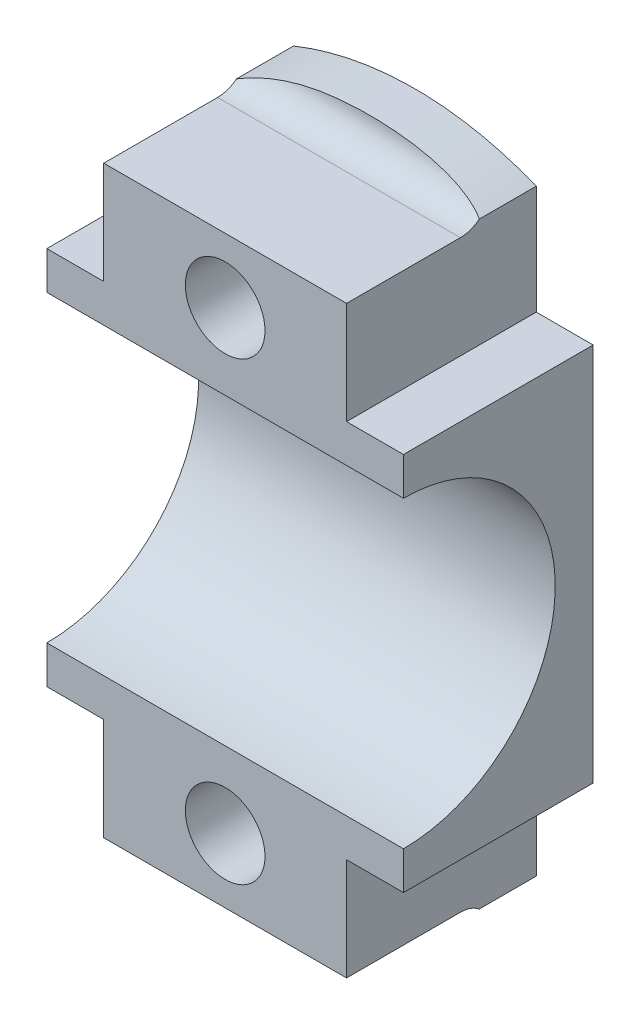
ISO-10303-21;
HEADER;
FILE_DESCRIPTION(('STEP AP214'),'2;1');
FILE_NAME('part.step','',(''),(''),'','','');
FILE_SCHEMA(('AUTOMOTIVE_DESIGN { 1 0 10303 214 1 1 1 1 }'));
ENDSEC;
DATA;
#1=APPLICATION_CONTEXT('core data for automotive mechanical design processes');
#2=APPLICATION_PROTOCOL_DEFINITION('international standard','automotive_design',2000,#1);
#3=PRODUCT_CONTEXT('',#1,'mechanical');
#4=PRODUCT('Part','Part','',(#3));
#5=PRODUCT_RELATED_PRODUCT_CATEGORY('part','',(#4));
#6=PRODUCT_DEFINITION_FORMATION('','',#4);
#7=PRODUCT_DEFINITION_CONTEXT('part definition',#1,'design');
#8=PRODUCT_DEFINITION('design','',#6,#7);
#9=PRODUCT_DEFINITION_SHAPE('','',#8);
#10=(LENGTH_UNIT() NAMED_UNIT(*) SI_UNIT(.MILLI.,.METRE.));
#11=(NAMED_UNIT(*) PLANE_ANGLE_UNIT() SI_UNIT($,.RADIAN.));
#12=(NAMED_UNIT(*) SI_UNIT($,.STERADIAN.) SOLID_ANGLE_UNIT());
#13=UNCERTAINTY_MEASURE_WITH_UNIT(LENGTH_MEASURE(1.E-05),#10,'distance_accuracy_value','');
#14=(GEOMETRIC_REPRESENTATION_CONTEXT(3) GLOBAL_UNCERTAINTY_ASSIGNED_CONTEXT((#13)) GLOBAL_UNIT_ASSIGNED_CONTEXT((#10,
#11,#12)) REPRESENTATION_CONTEXT('',''));
#15=CARTESIAN_POINT('',(0.,0.,0.));
#16=DIRECTION('',(0.,0.,1.));
#17=DIRECTION('',(1.,0.,0.));
#18=AXIS2_PLACEMENT_3D('',#15,#16,#17);
#19=CARTESIAN_POINT('',(-32.,0.,50.));
#20=DIRECTION('',(-1.,0.,0.));
#21=DIRECTION('',(0.,-1.,0.));
#22=AXIS2_PLACEMENT_3D('',#19,#20,#21);
#23=PLANE('',#22);
#24=DIRECTION('',(0.,0.,-1.));
#25=VECTOR('',#24,1.);
#26=CARTESIAN_POINT('',(-32.,-78.7464284904401,50.));
#27=LINE('',#26,#25);
#28=CARTESIAN_POINT('',(-32.,-78.7464284904402,15.010727169735));
#29=VERTEX_POINT('',#28);
#30=CARTESIAN_POINT('',(-32.,-78.7464284904401,0.));
#31=VERTEX_POINT('',#30);
#32=EDGE_CURVE('E306',#29,#31,#27,.T.);
#33=ORIENTED_EDGE('',*,*,#32,.F.);
#34=CARTESIAN_POINT('',(-32.,-85.0000000000001,20.));
#35=DIRECTION('',(-1.,0.,0.));
#36=DIRECTION('',(0.,-1.,0.));
#37=AXIS2_PLACEMENT_3D('',#34,#35,#36);
#38=CIRCLE('',#37,8.);
#39=CARTESIAN_POINT('',(-32.,-77.0000000000001,20.));
#40=VERTEX_POINT('',#39);
#41=EDGE_CURVE('E377',#29,#40,#38,.F.);
#42=ORIENTED_EDGE('',*,*,#41,.T.);
#43=DIRECTION('',(0.,0.,1.));
#44=VECTOR('',#43,1.);
#45=CARTESIAN_POINT('',(-32.,-77.,50.));
#46=LINE('',#45,#44);
#47=CARTESIAN_POINT('',(-32.,-77.,50.));
#48=VERTEX_POINT('',#47);
#49=EDGE_CURVE('E359',#40,#48,#46,.T.);
#50=ORIENTED_EDGE('',*,*,#49,.T.);
#51=DIRECTION('',(0.,1.,0.));
#52=VECTOR('',#51,1.);
#53=CARTESIAN_POINT('',(-32.,0.,50.));
#54=LINE('',#53,#52);
#55=CARTESIAN_POINT('',(-32.,-50.,50.));
#56=VERTEX_POINT('',#55);
#57=EDGE_CURVE('E204',#48,#56,#54,.T.);
#58=ORIENTED_EDGE('',*,*,#57,.T.);
#59=DIRECTION('',(0.,0.,-1.));
#60=VECTOR('',#59,1.);
#61=CARTESIAN_POINT('',(-32.,-50.,50.));
#62=LINE('',#61,#60);
#63=CARTESIAN_POINT('',(-32.,-50.,0.));
#64=VERTEX_POINT('',#63);
#65=EDGE_CURVE('E309',#56,#64,#62,.T.);
#66=ORIENTED_EDGE('',*,*,#65,.T.);
#67=DIRECTION('',(0.,1.,0.));
#68=VECTOR('',#67,1.);
#69=CARTESIAN_POINT('',(-32.,0.,0.));
#70=LINE('',#69,#68);
#71=EDGE_CURVE('E259',#31,#64,#70,.T.);
#72=ORIENTED_EDGE('',*,*,#71,.F.);
#73=EDGE_LOOP('',(#33,#42,#50,#58,#66,#72));
#74=FACE_BOUND('',#73,.T.);
#75=ADVANCED_FACE('F45',(#74),#23,.T.);
#76=CARTESIAN_POINT('',(0.,0.,50.));
#77=DIRECTION('',(0.,0.,-1.));
#78=DIRECTION('',(-1.,0.,0.));
#79=AXIS2_PLACEMENT_3D('',#76,#77,#78);
#80=CYLINDRICAL_SURFACE('',#79,85.);
#81=CARTESIAN_POINT('',(-32.,-78.7464284904402,15.010727169735));
#82=CARTESIAN_POINT('',(-31.8757358525958,-78.7969259631387,14.9474403065465));
#83=CARTESIAN_POINT('',(-31.7505314078796,-78.8474616876477,14.8860619473166));
#84=CARTESIAN_POINT('',(-31.4984410883804,-78.9485061891417,14.7668805031187));
#85=CARTESIAN_POINT('',(-31.3715554202109,-78.9990149686588,14.7090769836805));
#86=CARTESIAN_POINT('',(-30.9888000532411,-79.1502968126886,14.5407188232782));
#87=CARTESIAN_POINT('',(-30.7306654661683,-79.2508931137261,14.4351326895298));
#88=CARTESIAN_POINT('',(-30.2102660206429,-79.4507227251986,14.2358551926228));
#89=CARTESIAN_POINT('',(-29.9480140682081,-79.5499589633642,14.1421327450534));
#90=CARTESIAN_POINT('',(-29.4194905065431,-79.7469317802375,13.9648671175983));
#91=CARTESIAN_POINT('',(-29.1532181665553,-79.8446680796405,13.8813258139215));
#92=CARTESIAN_POINT('',(-28.6197469155445,-80.0374275781302,13.723997382611));
#93=CARTESIAN_POINT('',(-28.352577549491,-80.1324672174964,13.6501297586469));
#94=CARTESIAN_POINT('',(-27.8154537364429,-80.3204924356775,13.5103211598452));
#95=CARTESIAN_POINT('',(-27.5454991838961,-80.4134779362227,13.4443804866278));
#96=CARTESIAN_POINT('',(-27.0029889840283,-80.5972746197671,13.3195539953761));
#97=CARTESIAN_POINT('',(-26.7304314656932,-80.688084043413,13.2606737412709));
#98=CARTESIAN_POINT('',(-26.1832255651242,-80.8673086230854,13.1493076059319));
#99=CARTESIAN_POINT('',(-25.9085770949637,-80.955723677706,13.0968219951948));
#100=CARTESIAN_POINT('',(-25.207435447781,-81.1774869333944,12.9706036992787));
#101=CARTESIAN_POINT('',(-24.7796708726665,-81.3090948211613,12.9008580995404));
#102=CARTESIAN_POINT('',(-23.9204883515242,-81.5659937944659,12.7730943728766));
#103=CARTESIAN_POINT('',(-23.4890700485291,-81.6912842542813,12.7150774059312));
#104=CARTESIAN_POINT('',(-22.6230162932327,-81.9353501706612,12.6090849264248));
#105=CARTESIAN_POINT('',(-22.1883797936106,-82.05412339005,12.561112846259));
#106=CARTESIAN_POINT('',(-21.3164485800991,-82.284946548221,12.4737987532041));
#107=CARTESIAN_POINT('',(-20.879153731436,-82.3969961429432,12.4344571816804));
#108=CARTESIAN_POINT('',(-20.0017605279184,-82.614369676465,12.3631242924503));
#109=CARTESIAN_POINT('',(-19.5616595046269,-82.7196856439983,12.3311415739297));
#110=CARTESIAN_POINT('',(-18.6794328936537,-82.9233608511334,12.2735034072661));
#111=CARTESIAN_POINT('',(-18.2373072393048,-83.0217198598761,12.2478481690233));
#112=CARTESIAN_POINT('',(-16.9084381845925,-83.3062137560634,12.1789186903612));
#113=CARTESIAN_POINT('',(-16.0189990570267,-83.481815977195,12.1436650785596));
#114=CARTESIAN_POINT('',(-14.2255337906455,-83.806164225363,12.0878552906622));
#115=CARTESIAN_POINT('',(-13.321451129509,-83.9546204224826,12.0674514940243));
#116=CARTESIAN_POINT('',(-11.5087684315474,-84.2222513421853,12.0367565018833));
#117=CARTESIAN_POINT('',(-10.6001682423792,-84.3414250703581,12.0264656497724));
#118=CARTESIAN_POINT('',(-8.78023041593695,-84.5502566320817,12.0119670534763));
#119=CARTESIAN_POINT('',(-7.86889532826723,-84.6399364311942,12.0077547743253));
#120=CARTESIAN_POINT('',(-6.04380561869229,-84.7898034386422,12.0024108492913));
#121=CARTESIAN_POINT('',(-5.13005101490067,-84.8499908671469,12.0012791804101));
#122=CARTESIAN_POINT('',(-3.24435022335478,-84.9436268770276,12.0000515815455));
#123=CARTESIAN_POINT('',(-2.27230964744263,-84.9751856582418,12.0000242392115));
#124=CARTESIAN_POINT('',(-0.327708373695421,-85.0049305503612,11.999988115955));
#125=CARTESIAN_POINT('',(0.644852330537703,-85.0031162408427,11.9999793352663));
#126=CARTESIAN_POINT('',(2.58978071352564,-84.9661078829973,12.0000502626269));
#127=CARTESIAN_POINT('',(3.56214810457567,-84.9308986927157,12.00013001082));
#128=CARTESIAN_POINT('',(5.50508842483872,-84.8271209167262,12.0016999222396));
#129=CARTESIAN_POINT('',(6.47566137515311,-84.7585527258337,12.0031900687738));
#130=CARTESIAN_POINT('',(8.4136471374115,-84.5881581724898,12.0101525774523));
#131=CARTESIAN_POINT('',(9.38106063530471,-84.486339591549,12.0156240082336));
#132=CARTESIAN_POINT('',(11.3117985020905,-84.2495652441591,12.0343896777821));
#133=CARTESIAN_POINT('',(12.2751226684498,-84.114607855475,12.0476842995604));
#134=CARTESIAN_POINT('',(14.1956822381422,-83.8118536933647,12.0872459498619));
#135=CARTESIAN_POINT('',(15.1529215087344,-83.6440805130592,12.1135036790261));
#136=CARTESIAN_POINT('',(16.5834155377374,-83.3680167669548,12.1676732931317));
#137=CARTESIAN_POINT('',(17.0593352122547,-83.271932198385,12.1881926344927));
#138=CARTESIAN_POINT('',(18.0091718797905,-83.0716874879059,12.2351940301253));
#139=CARTESIAN_POINT('',(18.483088936429,-82.9675276046017,12.2616758935039));
#140=CARTESIAN_POINT('',(19.4232606959077,-82.7524430928749,12.3214064221138));
#141=CARTESIAN_POINT('',(19.8895411888483,-82.6416090331872,12.3545745735627));
#142=CARTESIAN_POINT('',(20.8195411583314,-82.4122325290468,12.4291342650418));
#143=CARTESIAN_POINT('',(21.2832606817342,-82.2936902261491,12.4705256540884));
#144=CARTESIAN_POINT('',(22.2080280814761,-82.0489634028035,12.5630308119746));
#145=CARTESIAN_POINT('',(22.6690741041527,-81.9227741459549,12.6141506492892));
#146=CARTESIAN_POINT('',(23.5876741580192,-81.6630236489972,12.727813668086));
#147=CARTESIAN_POINT('',(24.0452282592067,-81.5294625571049,12.7903566199556));
#148=CARTESIAN_POINT('',(24.9525846657081,-81.2563302592026,12.9283543613565));
#149=CARTESIAN_POINT('',(25.4024196458548,-81.1168147398521,13.0037034645616));
#150=CARTESIAN_POINT('',(26.2971701170268,-80.8311782033854,13.1700467776598));
#151=CARTESIAN_POINT('',(26.7420850028781,-80.685056384695,13.2610428898553));
#152=CARTESIAN_POINT('',(27.6251334792002,-80.3869944338232,13.4614677603964));
#153=CARTESIAN_POINT('',(28.0632751218969,-80.2350620996677,13.5708724408555));
#154=CARTESIAN_POINT('',(28.9315312469562,-79.9260818996247,13.8118016706136));
#155=CARTESIAN_POINT('',(29.3616487299869,-79.7690360088358,13.9433177592723));
#156=CARTESIAN_POINT('',(29.9757413916559,-79.5392724546682,14.152813745155));
#157=CARTESIAN_POINT('',(30.1639763758568,-79.4680730787051,14.2200510646715));
#158=CARTESIAN_POINT('',(30.5380157567482,-79.3250884590081,14.3603704978529));
#159=CARTESIAN_POINT('',(30.7238204004463,-79.253303276036,14.4334520120874));
#160=CARTESIAN_POINT('',(31.0933213077323,-79.1090691213609,14.5863100990613));
#161=CARTESIAN_POINT('',(31.2770071641088,-79.0366186740239,14.6661105533953));
#162=CARTESIAN_POINT('',(31.6411035851384,-78.8915654471925,14.8328770502627));
#163=CARTESIAN_POINT('',(31.8215131683405,-78.8189626290894,14.9198451981322));
#164=CARTESIAN_POINT('',(32.,-78.7464284904401,15.0107271697349));
#165=B_SPLINE_CURVE_WITH_KNOTS('',3,(#81,#82,#83,#84,#85,#86,#87,#88,#89,#90,#91,#92,#93,#94,
#95,#96,#97,#98,#99,#100,#101,#102,#103,#104,#105,#106,#107,#108,#109,#110,#111,#112,#113,#114,
#115,#116,#117,#118,#119,#120,#121,#122,#123,#124,#125,#126,#127,#128,#129,#130,#131,#132,#133,
#134,#135,#136,#137,#138,#139,#140,#141,#142,#143,#144,#145,#146,#147,#148,#149,#150,#151,#152,
#153,#154,#155,#156,#157,#158,#159,#160,#161,#162,#163,#164),.UNSPECIFIED.,.F.,.F.,(4,2,2,2,2,2,
2,2,2,2,2,2,2,2,2,2,2,2,2,2,2,2,2,2,2,2,2,2,2,2,2,2,2,2,2,2,2,2,2,2,2,4),(0.,0.444902145031601,
0.889750111944361,1.7788515985983,2.6655730567173,3.55245767598101,4.43141666898508,
5.31040909575958,6.19008971835571,7.06980753899216,8.42841337606781,9.78715351571338,
11.1463571896645,12.5056303572905,13.8664839264444,15.2273826328715,17.9485493919856,
20.6972598202735,23.4460635797826,26.1928155111862,28.9395469369654,31.8566263976373,
34.7737426067818,37.6921821315679,40.6105871164566,43.5283096027539,46.4461749480121,
49.3619501358289,50.8197297807598,52.2774627608147,53.7185912995455,55.1596933807258,
56.6016973661144,58.0436723693869,59.4742786459207,60.9050589731255,62.3339822240157,
63.7623599553684,64.3988397885675,65.0352544224937,65.6740352057967,66.3130042887355),.UNSPECIFIED.);
#166=CARTESIAN_POINT('',(32.,-78.7464284904401,15.0107271697349));
#167=VERTEX_POINT('',#166);
#168=EDGE_CURVE('E363',#29,#167,#165,.T.);
#169=ORIENTED_EDGE('',*,*,#168,.F.);
#170=ORIENTED_EDGE('',*,*,#32,.T.);
#171=CARTESIAN_POINT('',(0.,0.,0.));
#172=DIRECTION('',(0.,0.,1.));
#173=DIRECTION('',(1.,0.,0.));
#174=AXIS2_PLACEMENT_3D('',#171,#172,#173);
#175=CIRCLE('',#174,85.);
#176=CARTESIAN_POINT('',(32.,-78.7464284904401,0.));
#177=VERTEX_POINT('',#176);
#178=EDGE_CURVE('E263',#31,#177,#175,.T.);
#179=ORIENTED_EDGE('',*,*,#178,.T.);
#180=DIRECTION('',(0.,0.,-1.));
#181=VECTOR('',#180,1.);
#182=CARTESIAN_POINT('',(32.,-78.7464284904401,50.));
#183=LINE('',#182,#181);
#184=EDGE_CURVE('E303',#167,#177,#183,.T.);
#185=ORIENTED_EDGE('',*,*,#184,.F.);
#186=EDGE_LOOP('',(#169,#170,#179,#185));
#187=FACE_BOUND('',#186,.T.);
#188=ADVANCED_FACE('F379',(#187),#80,.T.);
#189=CARTESIAN_POINT('',(32.,0.,50.));
#190=DIRECTION('',(-1.,0.,0.));
#191=DIRECTION('',(0.,-1.,0.));
#192=AXIS2_PLACEMENT_3D('',#189,#190,#191);
#193=PLANE('',#192);
#194=CARTESIAN_POINT('',(32.,-85.,20.));
#195=DIRECTION('',(-1.,0.,0.));
#196=DIRECTION('',(0.,-1.,0.));
#197=AXIS2_PLACEMENT_3D('',#194,#195,#196);
#198=CIRCLE('',#197,8.);
#199=CARTESIAN_POINT('',(32.,-77.,20.));
#200=VERTEX_POINT('',#199);
#201=EDGE_CURVE('E333',#167,#200,#198,.F.);
#202=ORIENTED_EDGE('',*,*,#201,.F.);
#203=ORIENTED_EDGE('',*,*,#184,.T.);
#204=DIRECTION('',(0.,1.,0.));
#205=VECTOR('',#204,1.);
#206=CARTESIAN_POINT('',(32.,0.,0.));
#207=LINE('',#206,#205);
#208=CARTESIAN_POINT('',(32.,-50.,0.));
#209=VERTEX_POINT('',#208);
#210=EDGE_CURVE('E267',#177,#209,#207,.T.);
#211=ORIENTED_EDGE('',*,*,#210,.T.);
#212=DIRECTION('',(0.,0.,-1.));
#213=VECTOR('',#212,1.);
#214=CARTESIAN_POINT('',(32.,-50.,50.));
#215=LINE('',#214,#213);
#216=CARTESIAN_POINT('',(32.,-50.,50.));
#217=VERTEX_POINT('',#216);
#218=EDGE_CURVE('E299',#217,#209,#215,.T.);
#219=ORIENTED_EDGE('',*,*,#218,.F.);
#220=DIRECTION('',(0.,1.,0.));
#221=VECTOR('',#220,1.);
#222=CARTESIAN_POINT('',(32.,0.,50.));
#223=LINE('',#222,#221);
#224=CARTESIAN_POINT('',(32.,-77.,50.));
#225=VERTEX_POINT('',#224);
#226=EDGE_CURVE('E211',#225,#217,#223,.T.);
#227=ORIENTED_EDGE('',*,*,#226,.F.);
#228=DIRECTION('',(0.,0.,1.));
#229=VECTOR('',#228,1.);
#230=CARTESIAN_POINT('',(32.,-77.,50.));
#231=LINE('',#230,#229);
#232=EDGE_CURVE('E69',#200,#225,#231,.T.);
#233=ORIENTED_EDGE('',*,*,#232,.F.);
#234=EDGE_LOOP('',(#202,#203,#211,#219,#227,#233));
#235=FACE_BOUND('',#234,.T.);
#236=ADVANCED_FACE('F395',(#235),#193,.F.);
#237=CARTESIAN_POINT('',(0.,0.,50.));
#238=DIRECTION('',(0.,0.,1.));
#239=DIRECTION('',(1.,0.,0.));
#240=AXIS2_PLACEMENT_3D('',#237,#238,#239);
#241=PLANE('',#240);
#242=DIRECTION('',(1.,0.,0.));
#243=VECTOR('',#242,1.);
#244=CARTESIAN_POINT('',(-47.0000000000001,-40.0000000000001,50.));
#245=LINE('',#244,#243);
#246=CARTESIAN_POINT('',(-47.0000000000001,-40.0000000000001,50.));
#247=VERTEX_POINT('',#246);
#248=CARTESIAN_POINT('',(47.0000000000001,-39.9999999999999,50.));
#249=VERTEX_POINT('',#248);
#250=EDGE_CURVE('E179',#247,#249,#245,.T.);
#251=ORIENTED_EDGE('',*,*,#250,.F.);
#252=DIRECTION('',(0.,-1.,0.));
#253=VECTOR('',#252,1.);
#254=CARTESIAN_POINT('',(-47.,0.,50.));
#255=LINE('',#254,#253);
#256=CARTESIAN_POINT('',(-47.,-50.,50.));
#257=VERTEX_POINT('',#256);
#258=EDGE_CURVE('E188',#247,#257,#255,.T.);
#259=ORIENTED_EDGE('',*,*,#258,.T.);
#260=DIRECTION('',(-1.,0.,0.));
#261=VECTOR('',#260,1.);
#262=CARTESIAN_POINT('',(0.,-50.,50.));
#263=LINE('',#262,#261);
#264=EDGE_CURVE('E199',#56,#257,#263,.T.);
#265=ORIENTED_EDGE('',*,*,#264,.F.);
#266=ORIENTED_EDGE('',*,*,#57,.F.);
#267=DIRECTION('',(1.,0.,0.));
#268=VECTOR('',#267,1.);
#269=CARTESIAN_POINT('',(1.06858966120171E-13,-77.,50.));
#270=LINE('',#269,#268);
#271=EDGE_CURVE('E327',#48,#225,#270,.T.);
#272=ORIENTED_EDGE('',*,*,#271,.T.);
#273=ORIENTED_EDGE('',*,*,#226,.T.);
#274=DIRECTION('',(1.,0.,0.));
#275=VECTOR('',#274,1.);
#276=CARTESIAN_POINT('',(0.,-50.,50.));
#277=LINE('',#276,#275);
#278=CARTESIAN_POINT('',(47.,-50.,50.));
#279=VERTEX_POINT('',#278);
#280=EDGE_CURVE('E214',#217,#279,#277,.T.);
#281=ORIENTED_EDGE('',*,*,#280,.T.);
#282=DIRECTION('',(0.,-1.,0.));
#283=VECTOR('',#282,1.);
#284=CARTESIAN_POINT('',(47.0000000000001,0.,50.));
#285=LINE('',#284,#283);
#286=EDGE_CURVE('E218',#249,#279,#285,.T.);
#287=ORIENTED_EDGE('',*,*,#286,.F.);
#288=EDGE_LOOP('',(#251,#259,#265,#266,#272,#273,#281,#287));
#289=FACE_BOUND('',#288,.T.);
#290=CARTESIAN_POINT('',(0.,-60.,50.));
#291=DIRECTION('',(0.,0.,1.));
#292=DIRECTION('',(1.,0.,0.));
#293=AXIS2_PLACEMENT_3D('',#290,#291,#292);
#294=CIRCLE('',#293,10.5);
#295=CARTESIAN_POINT('',(10.5,-60.,50.));
#296=VERTEX_POINT('',#295);
#297=EDGE_CURVE('E230',#296,#296,#294,.T.);
#298=ORIENTED_EDGE('',*,*,#297,.F.);
#299=EDGE_LOOP('',(#298));
#300=FACE_BOUND('',#299,.T.);
#301=ADVANCED_FACE('F392',(#289,#300),#241,.T.);
#302=DIRECTION('',(1.,0.,0.));
#303=VECTOR('',#302,1.);
#304=CARTESIAN_POINT('',(-1.06858966120171E-13,77.,50.));
#305=LINE('',#304,#303);
#306=CARTESIAN_POINT('',(-32.,77.,50.));
#307=VERTEX_POINT('',#306);
#308=CARTESIAN_POINT('',(32.,77.0000000000001,50.));
#309=VERTEX_POINT('',#308);
#310=EDGE_CURVE('E330',#307,#309,#305,.T.);
#311=ORIENTED_EDGE('',*,*,#310,.F.);
#312=DIRECTION('',(0.,1.,0.));
#313=VECTOR('',#312,1.);
#314=CARTESIAN_POINT('',(-32.,0.,50.));
#315=LINE('',#314,#313);
#316=CARTESIAN_POINT('',(-32.,50.,50.));
#317=VERTEX_POINT('',#316);
#318=EDGE_CURVE('E357',#317,#307,#315,.T.);
#319=ORIENTED_EDGE('',*,*,#318,.F.);
#320=DIRECTION('',(-1.,0.,0.));
#321=VECTOR('',#320,1.);
#322=CARTESIAN_POINT('',(0.,50.,50.));
#323=LINE('',#322,#321);
#324=CARTESIAN_POINT('',(-47.,50.,50.));
#325=VERTEX_POINT('',#324);
#326=EDGE_CURVE('E196',#317,#325,#323,.T.);
#327=ORIENTED_EDGE('',*,*,#326,.T.);
#328=CARTESIAN_POINT('',(-47.0000000000002,39.9999999999999,50.));
#329=VERTEX_POINT('',#328);
#330=EDGE_CURVE('E186',#325,#329,#255,.T.);
#331=ORIENTED_EDGE('',*,*,#330,.T.);
#332=DIRECTION('',(1.,0.,0.));
#333=VECTOR('',#332,1.);
#334=CARTESIAN_POINT('',(-47.0000000000002,39.9999999999999,50.));
#335=LINE('',#334,#333);
#336=CARTESIAN_POINT('',(47.,40.,50.));
#337=VERTEX_POINT('',#336);
#338=EDGE_CURVE('E169',#329,#337,#335,.T.);
#339=ORIENTED_EDGE('',*,*,#338,.T.);
#340=CARTESIAN_POINT('',(47.,50.,50.));
#341=VERTEX_POINT('',#340);
#342=EDGE_CURVE('E219',#341,#337,#285,.T.);
#343=ORIENTED_EDGE('',*,*,#342,.F.);
#344=DIRECTION('',(1.,0.,0.));
#345=VECTOR('',#344,1.);
#346=CARTESIAN_POINT('',(0.,50.,50.));
#347=LINE('',#346,#345);
#348=CARTESIAN_POINT('',(32.,50.,50.));
#349=VERTEX_POINT('',#348);
#350=EDGE_CURVE('E222',#349,#341,#347,.T.);
#351=ORIENTED_EDGE('',*,*,#350,.F.);
#352=DIRECTION('',(0.,1.,0.));
#353=VECTOR('',#352,1.);
#354=CARTESIAN_POINT('',(32.,0.,50.));
#355=LINE('',#354,#353);
#356=EDGE_CURVE('E290',#349,#309,#355,.T.);
#357=ORIENTED_EDGE('',*,*,#356,.T.);
#358=EDGE_LOOP('',(#311,#319,#327,#331,#339,#343,#351,#357));
#359=FACE_BOUND('',#358,.T.);
#360=CARTESIAN_POINT('',(0.,60.,50.));
#361=DIRECTION('',(0.,0.,1.));
#362=DIRECTION('',(1.,0.,0.));
#363=AXIS2_PLACEMENT_3D('',#360,#361,#362);
#364=CIRCLE('',#363,10.5);
#365=CARTESIAN_POINT('',(10.5,60.,50.));
#366=VERTEX_POINT('',#365);
#367=EDGE_CURVE('E226',#366,#366,#364,.F.);
#368=ORIENTED_EDGE('',*,*,#367,.T.);
#369=EDGE_LOOP('',(#368));
#370=FACE_BOUND('',#369,.T.);
#371=ADVANCED_FACE('F192',(#359,#370),#241,.T.);
#372=CARTESIAN_POINT('',(32.,0.,50.));
#373=DIRECTION('',(-1.,0.,0.));
#374=DIRECTION('',(0.,0.,1.));
#375=AXIS2_PLACEMENT_3D('',#372,#373,#374);
#376=PLANE('',#375);
#377=CARTESIAN_POINT('',(32.,85.0000000000001,20.));
#378=DIRECTION('',(-1.,0.,0.));
#379=DIRECTION('',(0.,0.,1.));
#380=AXIS2_PLACEMENT_3D('',#377,#378,#379);
#381=CIRCLE('',#380,8.);
#382=CARTESIAN_POINT('',(32.,78.7464284904401,15.010727169735));
#383=VERTEX_POINT('',#382);
#384=CARTESIAN_POINT('',(32.,77.0000000000001,20.));
#385=VERTEX_POINT('',#384);
#386=EDGE_CURVE('E240',#383,#385,#381,.T.);
#387=ORIENTED_EDGE('',*,*,#386,.T.);
#388=DIRECTION('',(0.,0.,1.));
#389=VECTOR('',#388,1.);
#390=CARTESIAN_POINT('',(32.,77.0000000000001,50.));
#391=LINE('',#390,#389);
#392=EDGE_CURVE('E352',#385,#309,#391,.T.);
#393=ORIENTED_EDGE('',*,*,#392,.T.);
#394=ORIENTED_EDGE('',*,*,#356,.F.);
#395=DIRECTION('',(0.,0.,-1.));
#396=VECTOR('',#395,1.);
#397=CARTESIAN_POINT('',(32.,50.,50.));
#398=LINE('',#397,#396);
#399=CARTESIAN_POINT('',(32.,50.,0.));
#400=VERTEX_POINT('',#399);
#401=EDGE_CURVE('E234',#349,#400,#398,.T.);
#402=ORIENTED_EDGE('',*,*,#401,.T.);
#403=DIRECTION('',(0.,1.,0.));
#404=VECTOR('',#403,1.);
#405=CARTESIAN_POINT('',(32.,0.,0.));
#406=LINE('',#405,#404);
#407=CARTESIAN_POINT('',(32.,78.7464284904401,0.));
#408=VERTEX_POINT('',#407);
#409=EDGE_CURVE('E235',#400,#408,#406,.T.);
#410=ORIENTED_EDGE('',*,*,#409,.T.);
#411=DIRECTION('',(0.,0.,-1.));
#412=VECTOR('',#411,1.);
#413=CARTESIAN_POINT('',(32.,78.7464284904401,50.));
#414=LINE('',#413,#412);
#415=EDGE_CURVE('E324',#383,#408,#414,.T.);
#416=ORIENTED_EDGE('',*,*,#415,.F.);
#417=EDGE_LOOP('',(#387,#393,#394,#402,#410,#416));
#418=FACE_BOUND('',#417,.T.);
#419=ADVANCED_FACE('F47',(#418),#376,.F.);
#420=CARTESIAN_POINT('',(0.,0.,50.));
#421=DIRECTION('',(0.,0.,-1.));
#422=DIRECTION('',(-1.,0.,0.));
#423=AXIS2_PLACEMENT_3D('',#420,#421,#422);
#424=CYLINDRICAL_SURFACE('',#423,85.);
#425=DIRECTION('',(0.,0.,-1.));
#426=VECTOR('',#425,1.);
#427=CARTESIAN_POINT('',(-32.,78.7464284904401,50.));
#428=LINE('',#427,#426);
#429=CARTESIAN_POINT('',(-32.,78.7464284904401,15.0107271697349));
#430=VERTEX_POINT('',#429);
#431=CARTESIAN_POINT('',(-32.,78.7464284904401,0.));
#432=VERTEX_POINT('',#431);
#433=EDGE_CURVE('E321',#430,#432,#428,.T.);
#434=ORIENTED_EDGE('',*,*,#433,.F.);
#435=CARTESIAN_POINT('',(-32.,78.7464284904401,15.0107271697349));
#436=CARTESIAN_POINT('',(-31.8757358525959,78.7969259631387,14.9474403065464));
#437=CARTESIAN_POINT('',(-31.7505314078797,78.8474616876477,14.8860619473165));
#438=CARTESIAN_POINT('',(-31.4984410883804,78.9485061891417,14.7668805031186));
#439=CARTESIAN_POINT('',(-31.3715554202109,78.9990149686588,14.7090769836804));
#440=CARTESIAN_POINT('',(-30.9888000532411,79.1502968126886,14.5407188232781));
#441=CARTESIAN_POINT('',(-30.7306654661683,79.2508931137261,14.4351326895297));
#442=CARTESIAN_POINT('',(-30.2102660206429,79.4507227251986,14.2358551926227));
#443=CARTESIAN_POINT('',(-29.9480140682081,79.5499589633642,14.1421327450534));
#444=CARTESIAN_POINT('',(-29.419490506543,79.7469317802375,13.9648671175982));
#445=CARTESIAN_POINT('',(-29.1532181665553,79.8446680796405,13.8813258139214));
#446=CARTESIAN_POINT('',(-28.6197469155444,80.0374275781303,13.723997382611));
#447=CARTESIAN_POINT('',(-28.352577549491,80.1324672174964,13.6501297586468));
#448=CARTESIAN_POINT('',(-27.8154537364429,80.3204924356775,13.5103211598451));
#449=CARTESIAN_POINT('',(-27.5454991838961,80.4134779362228,13.4443804866277));
#450=CARTESIAN_POINT('',(-27.0029889840283,80.5972746197671,13.319553995376));
#451=CARTESIAN_POINT('',(-26.7304314656932,80.688084043413,13.2606737412709));
#452=CARTESIAN_POINT('',(-26.1832255651241,80.8673086230855,13.1493076059319));
#453=CARTESIAN_POINT('',(-25.9085770949636,80.955723677706,13.0968219951947));
#454=CARTESIAN_POINT('',(-25.2074354477809,81.1774869333945,12.9706036992787));
#455=CARTESIAN_POINT('',(-24.7796708726664,81.3090948211614,12.9008580995403));
#456=CARTESIAN_POINT('',(-23.9204883515241,81.565993794466,12.7730943728765));
#457=CARTESIAN_POINT('',(-23.4890700485289,81.6912842542813,12.7150774059312));
#458=CARTESIAN_POINT('',(-22.6230162932325,81.9353501706612,12.6090849264248));
#459=CARTESIAN_POINT('',(-22.1883797936104,82.0541233900501,12.561112846259));
#460=CARTESIAN_POINT('',(-21.3164485800989,82.284946548221,12.473798753204));
#461=CARTESIAN_POINT('',(-20.8791537314358,82.3969961429432,12.4344571816804));
#462=CARTESIAN_POINT('',(-20.0017605279182,82.6143696764651,12.3631242924503));
#463=CARTESIAN_POINT('',(-19.5616595046266,82.7196856439984,12.3311415739297));
#464=CARTESIAN_POINT('',(-18.6794328936534,82.9233608511334,12.2735034072661));
#465=CARTESIAN_POINT('',(-18.2373072393045,83.0217198598761,12.2478481690233));
#466=CARTESIAN_POINT('',(-16.9084381845922,83.3062137560634,12.1789186903612));
#467=CARTESIAN_POINT('',(-16.0189990570264,83.4818159771951,12.1436650785595));
#468=CARTESIAN_POINT('',(-14.2255337906451,83.806164225363,12.0878552906622));
#469=CARTESIAN_POINT('',(-13.3214511295086,83.9546204224826,12.0674514940243));
#470=CARTESIAN_POINT('',(-11.5087684315469,84.2222513421853,12.0367565018833));
#471=CARTESIAN_POINT('',(-10.6001682423787,84.3414250703581,12.0264656497724));
#472=CARTESIAN_POINT('',(-8.78023041593644,84.5502566320817,12.0119670534763));
#473=CARTESIAN_POINT('',(-7.8688953282667,84.6399364311943,12.0077547743253));
#474=CARTESIAN_POINT('',(-6.04380561869172,84.7898034386422,12.0024108492913));
#475=CARTESIAN_POINT('',(-5.13005101490007,84.8499908671469,12.0012791804101));
#476=CARTESIAN_POINT('',(-3.24435022335414,84.9436268770276,12.0000515815455));
#477=CARTESIAN_POINT('',(-2.27230964744197,84.9751856582418,12.0000242392115));
#478=CARTESIAN_POINT('',(-0.327708373694724,85.0049305503612,11.999988115955));
#479=CARTESIAN_POINT('',(0.64485233053842,85.0031162408427,11.9999793352663));
#480=CARTESIAN_POINT('',(2.5897807135264,84.9661078829973,12.0000502626269));
#481=CARTESIAN_POINT('',(3.56214810457644,84.9308986927156,12.00013001082));
#482=CARTESIAN_POINT('',(5.50508842483954,84.8271209167262,12.0016999222396));
#483=CARTESIAN_POINT('',(6.47566137515394,84.7585527258336,12.0031900687738));
#484=CARTESIAN_POINT('',(8.41364713741237,84.5881581724897,12.0101525774523));
#485=CARTESIAN_POINT('',(9.3810606353056,84.4863395915489,12.0156240082336));
#486=CARTESIAN_POINT('',(11.3117985020914,84.249565244159,12.0343896777821));
#487=CARTESIAN_POINT('',(12.2751226684508,84.1146078554748,12.0476842995604));
#488=CARTESIAN_POINT('',(14.1956822381432,83.8118536933646,12.087245949862));
#489=CARTESIAN_POINT('',(15.1529215087354,83.644080513059,12.1135036790261));
#490=CARTESIAN_POINT('',(16.5834155377384,83.3680167669546,12.1676732931317));
#491=CARTESIAN_POINT('',(17.0593352122558,83.2719321983848,12.1881926344927));
#492=CARTESIAN_POINT('',(18.0091718797916,83.0716874879057,12.2351940301253));
#493=CARTESIAN_POINT('',(18.48308893643,82.9675276046015,12.261675893504));
#494=CARTESIAN_POINT('',(19.4232606959088,82.7524430928747,12.3214064221139));
#495=CARTESIAN_POINT('',(19.8895411888492,82.6416090331869,12.3545745735628));
#496=CARTESIAN_POINT('',(20.8195411583322,82.4122325290465,12.4291342650419));
#497=CARTESIAN_POINT('',(21.2832606817351,82.2936902261488,12.4705256540885));
#498=CARTESIAN_POINT('',(22.2080280814768,82.0489634028032,12.5630308119747));
#499=CARTESIAN_POINT('',(22.6690741041535,81.9227741459546,12.6141506492893));
#500=CARTESIAN_POINT('',(23.5876741580199,81.6630236489971,12.7278136680861));
#501=CARTESIAN_POINT('',(24.0452282592073,81.5294625571048,12.7903566199557));
#502=CARTESIAN_POINT('',(24.9525846657086,81.2563302592025,12.9283543613566));
#503=CARTESIAN_POINT('',(25.4024196458553,81.1168147398519,13.0037034645618));
#504=CARTESIAN_POINT('',(26.2971701170273,80.8311782033853,13.17004677766));
#505=CARTESIAN_POINT('',(26.7420850028785,80.6850563846949,13.2610428898555));
#506=CARTESIAN_POINT('',(27.6251334792005,80.3869944338231,13.4614677603965));
#507=CARTESIAN_POINT('',(28.0632751218971,80.2350620996676,13.5708724408556));
#508=CARTESIAN_POINT('',(28.9315312469564,79.9260818996246,13.8118016706137));
#509=CARTESIAN_POINT('',(29.361648729987,79.7690360088357,13.9433177592724));
#510=CARTESIAN_POINT('',(29.975741391656,79.5392724546681,14.1528137451551));
#511=CARTESIAN_POINT('',(30.1639763758569,79.468073078705,14.2200510646716));
#512=CARTESIAN_POINT('',(30.5380157567483,79.325088459008,14.3603704978531));
#513=CARTESIAN_POINT('',(30.7238204004464,79.2533032760359,14.4334520120876));
#514=CARTESIAN_POINT('',(31.0933213077324,79.1090691213609,14.5863100990615));
#515=CARTESIAN_POINT('',(31.2770071641088,79.0366186740239,14.6661105533954));
#516=CARTESIAN_POINT('',(31.6411035851384,78.8915654471926,14.8328770502628));
#517=CARTESIAN_POINT('',(31.8215131683406,78.8189626290894,14.9198451981323));
#518=CARTESIAN_POINT('',(32.,78.7464284904401,15.010727169735));
#519=B_SPLINE_CURVE_WITH_KNOTS('',3,(#435,#436,#437,#438,#439,#440,#441,#442,#443,#444,#445,
#446,#447,#448,#449,#450,#451,#452,#453,#454,#455,#456,#457,#458,#459,#460,#461,#462,#463,#464,
#465,#466,#467,#468,#469,#470,#471,#472,#473,#474,#475,#476,#477,#478,#479,#480,#481,#482,#483,
#484,#485,#486,#487,#488,#489,#490,#491,#492,#493,#494,#495,#496,#497,#498,#499,#500,#501,#502,
#503,#504,#505,#506,#507,#508,#509,#510,#511,#512,#513,#514,#515,#516,#517,#518),.UNSPECIFIED.,
.F.,.F.,(4,2,2,2,2,2,2,2,2,2,2,2,2,2,2,2,2,2,2,2,2,2,2,2,2,2,2,2,2,2,2,2,2,2,2,2,2,2,2,2,2,4),
(0.,0.44490214503161,0.889750111944384,1.77885159859833,2.66557305671736,3.55245767598108,
4.43141666898516,5.31040909575967,6.19008971835581,7.06980753899229,8.42841337606797,
9.78715351571357,11.1463571896647,12.5056303572907,13.8664839264446,15.2273826328719,
17.948549391986,20.6972598202739,23.4460635797831,26.1928155111867,28.939546936966,
31.856626397638,34.7737426067825,37.6921821315687,40.6105871164574,43.5283096027548,
46.446174948013,49.36195013583,50.8197297807609,52.2774627608158,53.7185912995465,
55.1596933807266,56.6016973661152,58.0436723693875,59.4742786459212,60.9050589731259,
62.3339822240159,63.7623599553686,64.3988397885677,65.0352544224938,65.6740352057967,
66.3130042887355),.UNSPECIFIED.);
#520=EDGE_CURVE('E344',#430,#383,#519,.T.);
#521=ORIENTED_EDGE('',*,*,#520,.T.);
#522=ORIENTED_EDGE('',*,*,#415,.T.);
#523=CARTESIAN_POINT('',(0.,0.,0.));
#524=DIRECTION('',(0.,0.,1.));
#525=DIRECTION('',(1.,0.,0.));
#526=AXIS2_PLACEMENT_3D('',#523,#524,#525);
#527=CIRCLE('',#526,85.);
#528=EDGE_CURVE('E239',#408,#432,#527,.T.);
#529=ORIENTED_EDGE('',*,*,#528,.T.);
#530=EDGE_LOOP('',(#434,#521,#522,#529));
#531=FACE_BOUND('',#530,.T.);
#532=ADVANCED_FACE('F443',(#531),#424,.T.);
#533=CARTESIAN_POINT('',(-32.,0.,50.));
#534=DIRECTION('',(-1.,0.,0.));
#535=DIRECTION('',(0.,0.,1.));
#536=AXIS2_PLACEMENT_3D('',#533,#534,#535);
#537=PLANE('',#536);
#538=DIRECTION('',(0.,0.,1.));
#539=VECTOR('',#538,1.);
#540=CARTESIAN_POINT('',(-32.,77.,50.));
#541=LINE('',#540,#539);
#542=CARTESIAN_POINT('',(-32.,77.,20.));
#543=VERTEX_POINT('',#542);
#544=EDGE_CURVE('E350',#543,#307,#541,.T.);
#545=ORIENTED_EDGE('',*,*,#544,.F.);
#546=CARTESIAN_POINT('',(-32.,85.,20.));
#547=DIRECTION('',(-1.,0.,0.));
#548=DIRECTION('',(0.,0.,1.));
#549=AXIS2_PLACEMENT_3D('',#546,#547,#548);
#550=CIRCLE('',#549,8.);
#551=EDGE_CURVE('E54',#430,#543,#550,.T.);
#552=ORIENTED_EDGE('',*,*,#551,.F.);
#553=ORIENTED_EDGE('',*,*,#433,.T.);
#554=DIRECTION('',(0.,1.,0.));
#555=VECTOR('',#554,1.);
#556=CARTESIAN_POINT('',(-32.,0.,0.));
#557=LINE('',#556,#555);
#558=CARTESIAN_POINT('',(-32.,50.,0.));
#559=VERTEX_POINT('',#558);
#560=EDGE_CURVE('E244',#559,#432,#557,.T.);
#561=ORIENTED_EDGE('',*,*,#560,.F.);
#562=DIRECTION('',(0.,0.,-1.));
#563=VECTOR('',#562,1.);
#564=CARTESIAN_POINT('',(-32.,50.,50.));
#565=LINE('',#564,#563);
#566=EDGE_CURVE('E318',#317,#559,#565,.T.);
#567=ORIENTED_EDGE('',*,*,#566,.F.);
#568=ORIENTED_EDGE('',*,*,#318,.T.);
#569=EDGE_LOOP('',(#545,#552,#553,#561,#567,#568));
#570=FACE_BOUND('',#569,.T.);
#571=ADVANCED_FACE('F356',(#570),#537,.T.);
#572=CARTESIAN_POINT('',(0.,50.,50.));
#573=DIRECTION('',(0.,-1.,0.));
#574=DIRECTION('',(1.,0.,0.));
#575=AXIS2_PLACEMENT_3D('',#572,#573,#574);
#576=PLANE('',#575);
#577=DIRECTION('',(-1.,0.,0.));
#578=VECTOR('',#577,1.);
#579=CARTESIAN_POINT('',(0.,50.,0.));
#580=LINE('',#579,#578);
#581=CARTESIAN_POINT('',(-47.,50.,0.));
#582=VERTEX_POINT('',#581);
#583=EDGE_CURVE('E248',#559,#582,#580,.T.);
#584=ORIENTED_EDGE('',*,*,#583,.T.);
#585=DIRECTION('',(0.,0.,-1.));
#586=VECTOR('',#585,1.);
#587=CARTESIAN_POINT('',(-47.,50.,50.));
#588=LINE('',#587,#586);
#589=EDGE_CURVE('E315',#325,#582,#588,.T.);
#590=ORIENTED_EDGE('',*,*,#589,.F.);
#591=ORIENTED_EDGE('',*,*,#326,.F.);
#592=ORIENTED_EDGE('',*,*,#566,.T.);
#593=EDGE_LOOP('',(#584,#590,#591,#592));
#594=FACE_BOUND('',#593,.T.);
#595=ADVANCED_FACE('F438',(#594),#576,.F.);
#596=CARTESIAN_POINT('',(-47.,0.,50.));
#597=DIRECTION('',(1.,0.,0.));
#598=DIRECTION('',(0.,0.,-1.));
#599=AXIS2_PLACEMENT_3D('',#596,#597,#598);
#600=PLANE('',#599);
#601=ORIENTED_EDGE('',*,*,#258,.F.);
#602=CARTESIAN_POINT('',(-47.0000000000001,-1.20736753927986E-13,50.));
#603=DIRECTION('',(1.,0.,0.));
#604=DIRECTION('',(0.,1.,0.));
#605=AXIS2_PLACEMENT_3D('',#602,#603,#604);
#606=CIRCLE('',#605,40.);
#607=EDGE_CURVE('E172',#247,#329,#606,.T.);
#608=ORIENTED_EDGE('',*,*,#607,.T.);
#609=ORIENTED_EDGE('',*,*,#330,.F.);
#610=ORIENTED_EDGE('',*,*,#589,.T.);
#611=DIRECTION('',(0.,-1.,0.));
#612=VECTOR('',#611,1.);
#613=CARTESIAN_POINT('',(-47.,0.,0.));
#614=LINE('',#613,#612);
#615=CARTESIAN_POINT('',(-47.,-50.,0.));
#616=VERTEX_POINT('',#615);
#617=EDGE_CURVE('E251',#582,#616,#614,.T.);
#618=ORIENTED_EDGE('',*,*,#617,.T.);
#619=DIRECTION('',(0.,0.,-1.));
#620=VECTOR('',#619,1.);
#621=CARTESIAN_POINT('',(-47.,-50.,50.));
#622=LINE('',#621,#620);
#623=EDGE_CURVE('E312',#257,#616,#622,.T.);
#624=ORIENTED_EDGE('',*,*,#623,.F.);
#625=EDGE_LOOP('',(#601,#608,#609,#610,#618,#624));
#626=FACE_BOUND('',#625,.T.);
#627=ADVANCED_FACE('F184',(#626),#600,.F.);
#628=CARTESIAN_POINT('',(0.,-50.,50.));
#629=DIRECTION('',(0.,-1.,0.));
#630=DIRECTION('',(1.,0.,0.));
#631=AXIS2_PLACEMENT_3D('',#628,#629,#630);
#632=PLANE('',#631);
#633=DIRECTION('',(-1.,0.,0.));
#634=VECTOR('',#633,1.);
#635=CARTESIAN_POINT('',(0.,-50.,0.));
#636=LINE('',#635,#634);
#637=EDGE_CURVE('E255',#64,#616,#636,.T.);
#638=ORIENTED_EDGE('',*,*,#637,.F.);
#639=ORIENTED_EDGE('',*,*,#65,.F.);
#640=ORIENTED_EDGE('',*,*,#264,.T.);
#641=ORIENTED_EDGE('',*,*,#623,.T.);
#642=EDGE_LOOP('',(#638,#639,#640,#641));
#643=FACE_BOUND('',#642,.T.);
#644=ADVANCED_FACE('F418',(#643),#632,.T.);
#645=CARTESIAN_POINT('',(0.,-50.,50.));
#646=DIRECTION('',(0.,1.,0.));
#647=DIRECTION('',(0.,0.,1.));
#648=AXIS2_PLACEMENT_3D('',#645,#646,#647);
#649=PLANE('',#648);
#650=DIRECTION('',(1.,0.,0.));
#651=VECTOR('',#650,1.);
#652=CARTESIAN_POINT('',(0.,-50.,0.));
#653=LINE('',#652,#651);
#654=CARTESIAN_POINT('',(47.,-50.,0.));
#655=VERTEX_POINT('',#654);
#656=EDGE_CURVE('E270',#209,#655,#653,.T.);
#657=ORIENTED_EDGE('',*,*,#656,.T.);
#658=DIRECTION('',(0.,0.,-1.));
#659=VECTOR('',#658,1.);
#660=CARTESIAN_POINT('',(47.,-50.,50.));
#661=LINE('',#660,#659);
#662=EDGE_CURVE('E296',#279,#655,#661,.T.);
#663=ORIENTED_EDGE('',*,*,#662,.F.);
#664=ORIENTED_EDGE('',*,*,#280,.F.);
#665=ORIENTED_EDGE('',*,*,#218,.T.);
#666=EDGE_LOOP('',(#657,#663,#664,#665));
#667=FACE_BOUND('',#666,.T.);
#668=ADVANCED_FACE('F415',(#667),#649,.F.);
#669=CARTESIAN_POINT('',(47.0000000000001,0.,50.));
#670=DIRECTION('',(1.,0.,0.));
#671=DIRECTION('',(0.,1.,0.));
#672=AXIS2_PLACEMENT_3D('',#669,#670,#671);
#673=PLANE('',#672);
#674=CARTESIAN_POINT('',(47.0000000000001,0.,50.));
#675=DIRECTION('',(1.,0.,0.));
#676=DIRECTION('',(0.,1.,0.));
#677=AXIS2_PLACEMENT_3D('',#674,#675,#676);
#678=CIRCLE('',#677,40.);
#679=EDGE_CURVE('E61',#249,#337,#678,.T.);
#680=ORIENTED_EDGE('',*,*,#679,.F.);
#681=ORIENTED_EDGE('',*,*,#286,.T.);
#682=ORIENTED_EDGE('',*,*,#662,.T.);
#683=DIRECTION('',(0.,-1.,0.));
#684=VECTOR('',#683,1.);
#685=CARTESIAN_POINT('',(47.0000000000001,0.,0.));
#686=LINE('',#685,#684);
#687=CARTESIAN_POINT('',(47.,50.,0.));
#688=VERTEX_POINT('',#687);
#689=EDGE_CURVE('E274',#688,#655,#686,.T.);
#690=ORIENTED_EDGE('',*,*,#689,.F.);
#691=DIRECTION('',(0.,0.,-1.));
#692=VECTOR('',#691,1.);
#693=CARTESIAN_POINT('',(47.,50.,50.));
#694=LINE('',#693,#692);
#695=EDGE_CURVE('E293',#341,#688,#694,.T.);
#696=ORIENTED_EDGE('',*,*,#695,.F.);
#697=ORIENTED_EDGE('',*,*,#342,.T.);
#698=EDGE_LOOP('',(#680,#681,#682,#690,#696,#697));
#699=FACE_BOUND('',#698,.T.);
#700=ADVANCED_FACE('F408',(#699),#673,.T.);
#701=CARTESIAN_POINT('',(0.,60.,50.));
#702=DIRECTION('',(0.,0.,-1.));
#703=DIRECTION('',(-1.,0.,0.));
#704=AXIS2_PLACEMENT_3D('',#701,#702,#703);
#705=CYLINDRICAL_SURFACE('',#704,10.5);
#706=ORIENTED_EDGE('',*,*,#367,.F.);
#707=EDGE_LOOP('',(#706));
#708=FACE_BOUND('',#707,.T.);
#709=CARTESIAN_POINT('',(0.,60.,0.));
#710=DIRECTION('',(0.,0.,1.));
#711=DIRECTION('',(1.,0.,0.));
#712=AXIS2_PLACEMENT_3D('',#709,#710,#711);
#713=CIRCLE('',#712,10.5);
#714=CARTESIAN_POINT('',(10.5,60.,0.));
#715=VERTEX_POINT('',#714);
#716=EDGE_CURVE('E282',#715,#715,#713,.F.);
#717=ORIENTED_EDGE('',*,*,#716,.T.);
#718=EDGE_LOOP('',(#717));
#719=FACE_BOUND('',#718,.T.);
#720=ADVANCED_FACE('F405',(#708,#719),#705,.F.);
#721=CARTESIAN_POINT('',(0.,50.,50.));
#722=DIRECTION('',(0.,1.,0.));
#723=DIRECTION('',(-1.,0.,0.));
#724=AXIS2_PLACEMENT_3D('',#721,#722,#723);
#725=PLANE('',#724);
#726=DIRECTION('',(1.,0.,0.));
#727=VECTOR('',#726,1.);
#728=CARTESIAN_POINT('',(0.,50.,0.));
#729=LINE('',#728,#727);
#730=EDGE_CURVE('E278',#400,#688,#729,.T.);
#731=ORIENTED_EDGE('',*,*,#730,.F.);
#732=ORIENTED_EDGE('',*,*,#401,.F.);
#733=ORIENTED_EDGE('',*,*,#350,.T.);
#734=ORIENTED_EDGE('',*,*,#695,.T.);
#735=EDGE_LOOP('',(#731,#732,#733,#734));
#736=FACE_BOUND('',#735,.T.);
#737=ADVANCED_FACE('F403',(#736),#725,.T.);
#738=CARTESIAN_POINT('',(0.,-60.,50.));
#739=DIRECTION('',(0.,0.,-1.));
#740=DIRECTION('',(-1.,0.,0.));
#741=AXIS2_PLACEMENT_3D('',#738,#739,#740);
#742=CYLINDRICAL_SURFACE('',#741,10.5);
#743=ORIENTED_EDGE('',*,*,#297,.T.);
#744=EDGE_LOOP('',(#743));
#745=FACE_BOUND('',#744,.T.);
#746=CARTESIAN_POINT('',(0.,-60.,0.));
#747=DIRECTION('',(0.,0.,1.));
#748=DIRECTION('',(1.,0.,0.));
#749=AXIS2_PLACEMENT_3D('',#746,#747,#748);
#750=CIRCLE('',#749,10.5);
#751=CARTESIAN_POINT('',(10.5,-60.,0.));
#752=VERTEX_POINT('',#751);
#753=EDGE_CURVE('E286',#752,#752,#750,.T.);
#754=ORIENTED_EDGE('',*,*,#753,.F.);
#755=EDGE_LOOP('',(#754));
#756=FACE_BOUND('',#755,.T.);
#757=ADVANCED_FACE('F399',(#745,#756),#742,.F.);
#758=CARTESIAN_POINT('',(0.,0.,0.));
#759=DIRECTION('',(0.,0.,1.));
#760=DIRECTION('',(1.,0.,0.));
#761=AXIS2_PLACEMENT_3D('',#758,#759,#760);
#762=PLANE('',#761);
#763=CARTESIAN_POINT('',(0.,0.,0.));
#764=DIRECTION('',(0.,0.,1.));
#765=DIRECTION('',(1.,0.,0.));
#766=AXIS2_PLACEMENT_3D('',#763,#764,#765);
#767=CIRCLE('',#766,10.);
#768=CARTESIAN_POINT('',(10.,0.,0.));
#769=VERTEX_POINT('',#768);
#770=EDGE_CURVE('E11',#769,#769,#767,.F.);
#771=ORIENTED_EDGE('',*,*,#770,.F.);
#772=EDGE_LOOP('',(#771));
#773=FACE_BOUND('',#772,.T.);
#774=ORIENTED_EDGE('',*,*,#409,.F.);
#775=ORIENTED_EDGE('',*,*,#730,.T.);
#776=ORIENTED_EDGE('',*,*,#689,.T.);
#777=ORIENTED_EDGE('',*,*,#656,.F.);
#778=ORIENTED_EDGE('',*,*,#210,.F.);
#779=ORIENTED_EDGE('',*,*,#178,.F.);
#780=ORIENTED_EDGE('',*,*,#71,.T.);
#781=ORIENTED_EDGE('',*,*,#637,.T.);
#782=ORIENTED_EDGE('',*,*,#617,.F.);
#783=ORIENTED_EDGE('',*,*,#583,.F.);
#784=ORIENTED_EDGE('',*,*,#560,.T.);
#785=ORIENTED_EDGE('',*,*,#528,.F.);
#786=EDGE_LOOP('',(#774,#775,#776,#777,#778,#779,#780,#781,#782,#783,#784,#785));
#787=FACE_BOUND('',#786,.T.);
#788=ORIENTED_EDGE('',*,*,#716,.F.);
#789=EDGE_LOOP('',(#788));
#790=FACE_BOUND('',#789,.T.);
#791=ORIENTED_EDGE('',*,*,#753,.T.);
#792=EDGE_LOOP('',(#791));
#793=FACE_BOUND('',#792,.T.);
#794=ADVANCED_FACE('F389',(#773,#787,#790,#793),#762,.F.);
#795=CARTESIAN_POINT('',(-47.,-85.0000000000001,20.));
#796=DIRECTION('',(1.,0.,0.));
#797=DIRECTION('',(0.,1.,0.));
#798=AXIS2_PLACEMENT_3D('',#795,#796,#797);
#799=CYLINDRICAL_SURFACE('',#798,8.);
#800=ORIENTED_EDGE('',*,*,#168,.T.);
#801=ORIENTED_EDGE('',*,*,#201,.T.);
#802=DIRECTION('',(1.,0.,0.));
#803=VECTOR('',#802,1.);
#804=CARTESIAN_POINT('',(-47.,-77.0000000000001,20.));
#805=LINE('',#804,#803);
#806=EDGE_CURVE('E469',#40,#200,#805,.T.);
#807=ORIENTED_EDGE('',*,*,#806,.F.);
#808=ORIENTED_EDGE('',*,*,#41,.F.);
#809=EDGE_LOOP('',(#800,#801,#807,#808));
#810=FACE_BOUND('',#809,.T.);
#811=ADVANCED_FACE('F383',(#810),#799,.F.);
#812=CARTESIAN_POINT('',(-47.,-77.0000000000001,0.));
#813=DIRECTION('',(0.,-1.,0.));
#814=DIRECTION('',(1.,0.,0.));
#815=AXIS2_PLACEMENT_3D('',#812,#813,#814);
#816=PLANE('',#815);
#817=ORIENTED_EDGE('',*,*,#806,.T.);
#818=ORIENTED_EDGE('',*,*,#232,.T.);
#819=ORIENTED_EDGE('',*,*,#271,.F.);
#820=ORIENTED_EDGE('',*,*,#49,.F.);
#821=EDGE_LOOP('',(#817,#818,#819,#820));
#822=FACE_BOUND('',#821,.T.);
#823=ADVANCED_FACE('F388',(#822),#816,.T.);
#824=CARTESIAN_POINT('',(-47.0000000000001,-1.20736753927986E-13,50.));
#825=DIRECTION('',(1.,0.,0.));
#826=DIRECTION('',(0.,1.,0.));
#827=AXIS2_PLACEMENT_3D('',#824,#825,#826);
#828=CYLINDRICAL_SURFACE('',#827,40.);
#829=ORIENTED_EDGE('',*,*,#679,.T.);
#830=ORIENTED_EDGE('',*,*,#338,.F.);
#831=ORIENTED_EDGE('',*,*,#607,.F.);
#832=ORIENTED_EDGE('',*,*,#250,.T.);
#833=EDGE_LOOP('',(#829,#830,#831,#832));
#834=FACE_BOUND('',#833,.T.);
#835=ADVANCED_FACE('F171',(#834),#828,.F.);
#836=CARTESIAN_POINT('',(-47.0000000000002,85.,20.));
#837=DIRECTION('',(1.,0.,0.));
#838=DIRECTION('',(0.,1.,0.));
#839=AXIS2_PLACEMENT_3D('',#836,#837,#838);
#840=CYLINDRICAL_SURFACE('',#839,8.);
#841=ORIENTED_EDGE('',*,*,#520,.F.);
#842=ORIENTED_EDGE('',*,*,#551,.T.);
#843=DIRECTION('',(1.,0.,0.));
#844=VECTOR('',#843,1.);
#845=CARTESIAN_POINT('',(-47.0000000000002,77.,20.));
#846=LINE('',#845,#844);
#847=EDGE_CURVE('E341',#543,#385,#846,.T.);
#848=ORIENTED_EDGE('',*,*,#847,.T.);
#849=ORIENTED_EDGE('',*,*,#386,.F.);
#850=EDGE_LOOP('',(#841,#842,#848,#849));
#851=FACE_BOUND('',#850,.T.);
#852=ADVANCED_FACE('F340',(#851),#840,.F.);
#853=CARTESIAN_POINT('',(-47.0000000000002,77.,0.));
#854=DIRECTION('',(0.,-1.,0.));
#855=DIRECTION('',(1.,0.,0.));
#856=AXIS2_PLACEMENT_3D('',#853,#854,#855);
#857=PLANE('',#856);
#858=ORIENTED_EDGE('',*,*,#847,.F.);
#859=ORIENTED_EDGE('',*,*,#544,.T.);
#860=ORIENTED_EDGE('',*,*,#310,.T.);
#861=ORIENTED_EDGE('',*,*,#392,.F.);
#862=EDGE_LOOP('',(#858,#859,#860,#861));
#863=FACE_BOUND('',#862,.T.);
#864=ADVANCED_FACE('F349',(#863),#857,.F.);
#865=CARTESIAN_POINT('',(0.,0.,-5.));
#866=DIRECTION('',(0.,0.,1.));
#867=DIRECTION('',(1.,0.,0.));
#868=AXIS2_PLACEMENT_3D('',#865,#866,#867);
#869=CYLINDRICAL_SURFACE('',#868,10.);
#870=CARTESIAN_POINT('',(0.,0.,-5.));
#871=DIRECTION('',(0.,0.,-1.));
#872=DIRECTION('',(-1.,0.,0.));
#873=AXIS2_PLACEMENT_3D('',#870,#871,#872);
#874=CIRCLE('',#873,10.);
#875=CARTESIAN_POINT('',(-10.,0.,-5.));
#876=VERTEX_POINT('',#875);
#877=EDGE_CURVE('E472',#876,#876,#874,.T.);
#878=ORIENTED_EDGE('',*,*,#877,.F.);
#879=EDGE_LOOP('',(#878));
#880=FACE_BOUND('',#879,.T.);
#881=ORIENTED_EDGE('',*,*,#770,.T.);
#882=EDGE_LOOP('',(#881));
#883=FACE_BOUND('',#882,.T.);
#884=ADVANCED_FACE('F459',(#880,#883),#869,.T.);
#885=CARTESIAN_POINT('',(0.,0.,-5.));
#886=DIRECTION('',(0.,0.,-1.));
#887=DIRECTION('',(-1.,0.,0.));
#888=AXIS2_PLACEMENT_3D('',#885,#886,#887);
#889=PLANE('',#888);
#890=ORIENTED_EDGE('',*,*,#877,.T.);
#891=EDGE_LOOP('',(#890));
#892=FACE_BOUND('',#891,.T.);
#893=ADVANCED_FACE('F487',(#892),#889,.T.);
#894=CLOSED_SHELL('',(#75,#188,#236,#301,#371,#419,#532,#571,#595,#627,#644,#668,#700,#720,#737,
#757,#794,#811,#823,#835,#852,#864,#884,#893));
#895=MANIFOLD_SOLID_BREP('B2',#894);
#896=ADVANCED_BREP_SHAPE_REPRESENTATION('',(#18,#895),#14);
#897=SHAPE_DEFINITION_REPRESENTATION(#9,#896);
ENDSEC;
END-ISO-10303-21;
